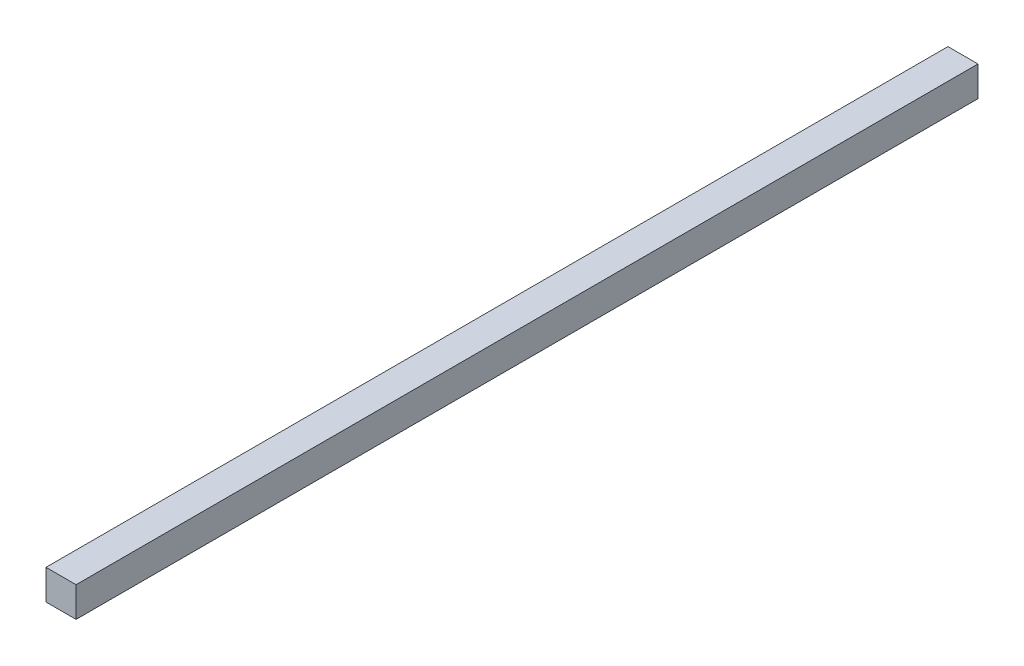
ISO-10303-21;
HEADER;
FILE_DESCRIPTION(('STEP AP214'),'2;1');
FILE_NAME('part.step','',(''),(''),'','','');
FILE_SCHEMA(('AUTOMOTIVE_DESIGN { 1 0 10303 214 1 1 1 1 }'));
ENDSEC;
DATA;
#1=APPLICATION_CONTEXT('core data for automotive mechanical design processes');
#2=APPLICATION_PROTOCOL_DEFINITION('international standard','automotive_design',2000,#1);
#3=PRODUCT_CONTEXT('',#1,'mechanical');
#4=PRODUCT('Part','Part','',(#3));
#5=PRODUCT_RELATED_PRODUCT_CATEGORY('part','',(#4));
#6=PRODUCT_DEFINITION_FORMATION('','',#4);
#7=PRODUCT_DEFINITION_CONTEXT('part definition',#1,'design');
#8=PRODUCT_DEFINITION('design','',#6,#7);
#9=PRODUCT_DEFINITION_SHAPE('','',#8);
#10=(LENGTH_UNIT() NAMED_UNIT(*) SI_UNIT(.MILLI.,.METRE.));
#11=(NAMED_UNIT(*) PLANE_ANGLE_UNIT() SI_UNIT($,.RADIAN.));
#12=(NAMED_UNIT(*) SI_UNIT($,.STERADIAN.) SOLID_ANGLE_UNIT());
#13=UNCERTAINTY_MEASURE_WITH_UNIT(LENGTH_MEASURE(1.E-05),#10,'distance_accuracy_value','');
#14=(GEOMETRIC_REPRESENTATION_CONTEXT(3) GLOBAL_UNCERTAINTY_ASSIGNED_CONTEXT((#13)) GLOBAL_UNIT_ASSIGNED_CONTEXT((#10,
#11,#12)) REPRESENTATION_CONTEXT('',''));
#15=CARTESIAN_POINT('',(0.,0.,0.));
#16=DIRECTION('',(0.,0.,1.));
#17=DIRECTION('',(1.,0.,0.));
#18=AXIS2_PLACEMENT_3D('',#15,#16,#17);
#19=CARTESIAN_POINT('',(0.,0.,190.5));
#20=DIRECTION('',(1.,0.,0.));
#21=DIRECTION('',(0.,0.,-1.));
#22=AXIS2_PLACEMENT_3D('',#19,#20,#21);
#23=PLANE('',#22);
#24=DIRECTION('',(0.,-1.,0.));
#25=VECTOR('',#24,1.);
#26=CARTESIAN_POINT('',(0.,0.,0.));
#27=LINE('',#26,#25);
#28=CARTESIAN_POINT('',(0.,6.35,0.));
#29=VERTEX_POINT('',#28);
#30=CARTESIAN_POINT('',(0.,0.,0.));
#31=VERTEX_POINT('',#30);
#32=EDGE_CURVE('E96',#29,#31,#27,.T.);
#33=ORIENTED_EDGE('',*,*,#32,.T.);
#34=DIRECTION('',(0.,0.,-1.));
#35=VECTOR('',#34,1.);
#36=CARTESIAN_POINT('',(0.,0.,190.5));
#37=LINE('',#36,#35);
#38=CARTESIAN_POINT('',(0.,0.,190.5));
#39=VERTEX_POINT('',#38);
#40=EDGE_CURVE('E11',#39,#31,#37,.T.);
#41=ORIENTED_EDGE('',*,*,#40,.F.);
#42=DIRECTION('',(0.,-1.,0.));
#43=VECTOR('',#42,1.);
#44=CARTESIAN_POINT('',(0.,0.,190.5));
#45=LINE('',#44,#43);
#46=CARTESIAN_POINT('',(0.,6.35,190.5));
#47=VERTEX_POINT('',#46);
#48=EDGE_CURVE('E84',#47,#39,#45,.T.);
#49=ORIENTED_EDGE('',*,*,#48,.F.);
#50=DIRECTION('',(0.,0.,-1.));
#51=VECTOR('',#50,1.);
#52=CARTESIAN_POINT('',(0.,6.35,190.5));
#53=LINE('',#52,#51);
#54=EDGE_CURVE('E92',#47,#29,#53,.T.);
#55=ORIENTED_EDGE('',*,*,#54,.T.);
#56=EDGE_LOOP('',(#33,#41,#49,#55));
#57=FACE_BOUND('',#56,.T.);
#58=ADVANCED_FACE('F33',(#57),#23,.F.);
#59=CARTESIAN_POINT('',(0.,0.,190.5));
#60=DIRECTION('',(0.,1.,0.));
#61=DIRECTION('',(0.,0.,1.));
#62=AXIS2_PLACEMENT_3D('',#59,#60,#61);
#63=PLANE('',#62);
#64=DIRECTION('',(1.,0.,0.));
#65=VECTOR('',#64,1.);
#66=CARTESIAN_POINT('',(0.,0.,0.));
#67=LINE('',#66,#65);
#68=CARTESIAN_POINT('',(6.35,0.,0.));
#69=VERTEX_POINT('',#68);
#70=EDGE_CURVE('E88',#31,#69,#67,.T.);
#71=ORIENTED_EDGE('',*,*,#70,.T.);
#72=DIRECTION('',(0.,0.,-1.));
#73=VECTOR('',#72,1.);
#74=CARTESIAN_POINT('',(6.35,0.,190.5));
#75=LINE('',#74,#73);
#76=CARTESIAN_POINT('',(6.35,0.,190.5));
#77=VERTEX_POINT('',#76);
#78=EDGE_CURVE('E41',#77,#69,#75,.T.);
#79=ORIENTED_EDGE('',*,*,#78,.F.);
#80=DIRECTION('',(1.,0.,0.));
#81=VECTOR('',#80,1.);
#82=CARTESIAN_POINT('',(0.,0.,190.5));
#83=LINE('',#82,#81);
#84=EDGE_CURVE('E79',#39,#77,#83,.T.);
#85=ORIENTED_EDGE('',*,*,#84,.F.);
#86=ORIENTED_EDGE('',*,*,#40,.T.);
#87=EDGE_LOOP('',(#71,#79,#85,#86));
#88=FACE_BOUND('',#87,.T.);
#89=ADVANCED_FACE('F87',(#88),#63,.F.);
#90=CARTESIAN_POINT('',(6.35,0.,190.5));
#91=DIRECTION('',(-1.,0.,0.));
#92=DIRECTION('',(0.,0.,1.));
#93=AXIS2_PLACEMENT_3D('',#90,#91,#92);
#94=PLANE('',#93);
#95=DIRECTION('',(0.,1.,0.));
#96=VECTOR('',#95,1.);
#97=CARTESIAN_POINT('',(6.35,0.,0.));
#98=LINE('',#97,#96);
#99=CARTESIAN_POINT('',(6.35,6.35,0.));
#100=VERTEX_POINT('',#99);
#101=EDGE_CURVE('E66',#69,#100,#98,.T.);
#102=ORIENTED_EDGE('',*,*,#101,.T.);
#103=DIRECTION('',(0.,0.,-1.));
#104=VECTOR('',#103,1.);
#105=CARTESIAN_POINT('',(6.35,6.35,190.5));
#106=LINE('',#105,#104);
#107=CARTESIAN_POINT('',(6.35,6.35,190.5));
#108=VERTEX_POINT('',#107);
#109=EDGE_CURVE('E89',#108,#100,#106,.T.);
#110=ORIENTED_EDGE('',*,*,#109,.F.);
#111=DIRECTION('',(0.,1.,0.));
#112=VECTOR('',#111,1.);
#113=CARTESIAN_POINT('',(6.35,0.,190.5));
#114=LINE('',#113,#112);
#115=EDGE_CURVE('E82',#77,#108,#114,.T.);
#116=ORIENTED_EDGE('',*,*,#115,.F.);
#117=ORIENTED_EDGE('',*,*,#78,.T.);
#118=EDGE_LOOP('',(#102,#110,#116,#117));
#119=FACE_BOUND('',#118,.T.);
#120=ADVANCED_FACE('F90',(#119),#94,.F.);
#121=CARTESIAN_POINT('',(0.,6.35,190.5));
#122=DIRECTION('',(0.,-1.,0.));
#123=DIRECTION('',(0.,0.,-1.));
#124=AXIS2_PLACEMENT_3D('',#121,#122,#123);
#125=PLANE('',#124);
#126=DIRECTION('',(-1.,0.,0.));
#127=VECTOR('',#126,1.);
#128=CARTESIAN_POINT('',(0.,6.35,0.));
#129=LINE('',#128,#127);
#130=EDGE_CURVE('E72',#100,#29,#129,.T.);
#131=ORIENTED_EDGE('',*,*,#130,.T.);
#132=ORIENTED_EDGE('',*,*,#54,.F.);
#133=DIRECTION('',(-1.,0.,0.));
#134=VECTOR('',#133,1.);
#135=CARTESIAN_POINT('',(0.,6.35,190.5));
#136=LINE('',#135,#134);
#137=EDGE_CURVE('E49',#108,#47,#136,.T.);
#138=ORIENTED_EDGE('',*,*,#137,.F.);
#139=ORIENTED_EDGE('',*,*,#109,.T.);
#140=EDGE_LOOP('',(#131,#132,#138,#139));
#141=FACE_BOUND('',#140,.T.);
#142=ADVANCED_FACE('F103',(#141),#125,.F.);
#143=CARTESIAN_POINT('',(0.,0.,190.5));
#144=DIRECTION('',(0.,0.,-1.));
#145=DIRECTION('',(-1.,0.,0.));
#146=AXIS2_PLACEMENT_3D('',#143,#144,#145);
#147=PLANE('',#146);
#148=ORIENTED_EDGE('',*,*,#48,.T.);
#149=ORIENTED_EDGE('',*,*,#84,.T.);
#150=ORIENTED_EDGE('',*,*,#115,.T.);
#151=ORIENTED_EDGE('',*,*,#137,.T.);
#152=EDGE_LOOP('',(#148,#149,#150,#151));
#153=FACE_BOUND('',#152,.T.);
#154=ADVANCED_FACE('F80',(#153),#147,.F.);
#155=CARTESIAN_POINT('',(0.,0.,0.));
#156=DIRECTION('',(0.,0.,-1.));
#157=DIRECTION('',(-1.,0.,0.));
#158=AXIS2_PLACEMENT_3D('',#155,#156,#157);
#159=PLANE('',#158);
#160=ORIENTED_EDGE('',*,*,#32,.F.);
#161=ORIENTED_EDGE('',*,*,#130,.F.);
#162=ORIENTED_EDGE('',*,*,#101,.F.);
#163=ORIENTED_EDGE('',*,*,#70,.F.);
#164=EDGE_LOOP('',(#160,#161,#162,#163));
#165=FACE_BOUND('',#164,.T.);
#166=ADVANCED_FACE('F106',(#165),#159,.T.);
#167=CLOSED_SHELL('',(#58,#89,#120,#142,#154,#166));
#168=MANIFOLD_SOLID_BREP('B2',#167);
#169=ADVANCED_BREP_SHAPE_REPRESENTATION('',(#18,#168),#14);
#170=SHAPE_DEFINITION_REPRESENTATION(#9,#169);
ENDSEC;
END-ISO-10303-21;
